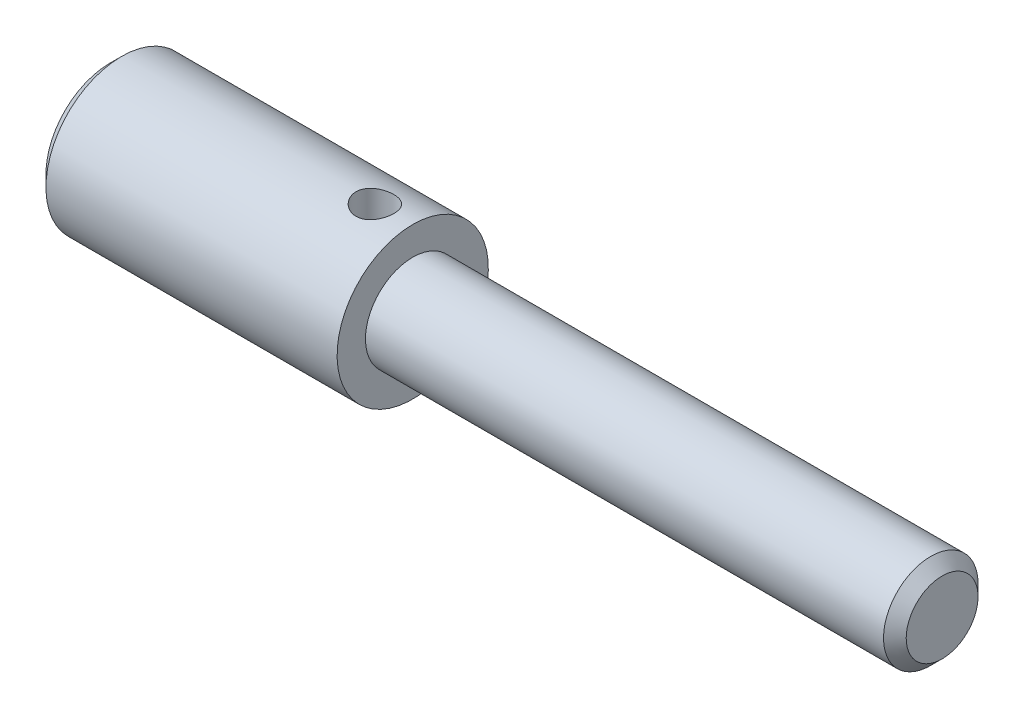
ISO-10303-21;
HEADER;
FILE_DESCRIPTION(('STEP AP214'),'2;1');
FILE_NAME('part.step','',(''),(''),'','','');
FILE_SCHEMA(('AUTOMOTIVE_DESIGN { 1 0 10303 214 1 1 1 1 }'));
ENDSEC;
DATA;
#1=APPLICATION_CONTEXT('core data for automotive mechanical design processes');
#2=APPLICATION_PROTOCOL_DEFINITION('international standard','automotive_design',2000,#1);
#3=PRODUCT_CONTEXT('',#1,'mechanical');
#4=PRODUCT('Part','Part','',(#3));
#5=PRODUCT_RELATED_PRODUCT_CATEGORY('part','',(#4));
#6=PRODUCT_DEFINITION_FORMATION('','',#4);
#7=PRODUCT_DEFINITION_CONTEXT('part definition',#1,'design');
#8=PRODUCT_DEFINITION('design','',#6,#7);
#9=PRODUCT_DEFINITION_SHAPE('','',#8);
#10=(LENGTH_UNIT() NAMED_UNIT(*) SI_UNIT(.MILLI.,.METRE.));
#11=(NAMED_UNIT(*) PLANE_ANGLE_UNIT() SI_UNIT($,.RADIAN.));
#12=(NAMED_UNIT(*) SI_UNIT($,.STERADIAN.) SOLID_ANGLE_UNIT());
#13=UNCERTAINTY_MEASURE_WITH_UNIT(LENGTH_MEASURE(1.E-05),#10,'distance_accuracy_value','');
#14=(GEOMETRIC_REPRESENTATION_CONTEXT(3) GLOBAL_UNCERTAINTY_ASSIGNED_CONTEXT((#13)) GLOBAL_UNIT_ASSIGNED_CONTEXT((#10,
#11,#12)) REPRESENTATION_CONTEXT('',''));
#15=CARTESIAN_POINT('',(0.,0.,0.));
#16=DIRECTION('',(0.,0.,1.));
#17=DIRECTION('',(1.,0.,0.));
#18=AXIS2_PLACEMENT_3D('',#15,#16,#17);
#19=CARTESIAN_POINT('',(0.,-4.,0.));
#20=DIRECTION('',(-1.,0.,0.));
#21=DIRECTION('',(0.,-1.,0.));
#22=AXIS2_PLACEMENT_3D('',#19,#20,#21);
#23=PLANE('',#22);
#24=CARTESIAN_POINT('',(0.,-4.,0.));
#25=DIRECTION('',(-1.,0.,0.));
#26=DIRECTION('',(0.,-1.,0.));
#27=AXIS2_PLACEMENT_3D('',#24,#25,#26);
#28=CIRCLE('',#27,3.39999999999999);
#29=CARTESIAN_POINT('',(0.,-4.,-3.39999999999999));
#30=VERTEX_POINT('',#29);
#31=EDGE_CURVE('E12',#30,#30,#28,.T.);
#32=ORIENTED_EDGE('',*,*,#31,.T.);
#33=EDGE_LOOP('',(#32));
#34=FACE_BOUND('',#33,.T.);
#35=ADVANCED_FACE('F46',(#34),#23,.T.);
#36=CARTESIAN_POINT('',(44.,-3.99999999999999,0.));
#37=DIRECTION('',(1.,0.,0.));
#38=DIRECTION('',(0.,1.,0.));
#39=AXIS2_PLACEMENT_3D('',#36,#37,#38);
#40=CYLINDRICAL_SURFACE('',#39,4.);
#41=CARTESIAN_POINT('',(14.,-0.127016653792582,1.));
#42=CARTESIAN_POINT('',(13.9447796996432,-0.12701559942815,0.999998431438699));
#43=CARTESIAN_POINT('',(13.8895420405686,-0.125822775007214,0.995410498208069));
#44=CARTESIAN_POINT('',(13.7806529687674,-0.121192551077508,0.977209250194446));
#45=CARTESIAN_POINT('',(13.72700249822,-0.117753845258195,0.963590682698077));
#46=CARTESIAN_POINT('',(13.6228785847122,-0.10904510186988,0.927796479849635));
#47=CARTESIAN_POINT('',(13.5724011378422,-0.103777429306402,0.905631891140943));
#48=CARTESIAN_POINT('',(13.4758756589875,-0.0920072318167267,0.853408456505407));
#49=CARTESIAN_POINT('',(13.4298278151689,-0.0855046544675919,0.823349275424505));
#50=CARTESIAN_POINT('',(13.3424553418942,-0.0718371345963169,0.755483370924518));
#51=CARTESIAN_POINT('',(13.3012425598597,-0.064661609512907,0.717534755081558));
#52=CARTESIAN_POINT('',(13.2256954422561,-0.0505484979337787,0.635272825640328));
#53=CARTESIAN_POINT('',(13.1913617497514,-0.0436109337330855,0.59095891767214));
#54=CARTESIAN_POINT('',(13.1300898129474,-0.0306383379190493,0.496458080431565));
#55=CARTESIAN_POINT('',(13.1032614447354,-0.0246172503979988,0.446197830478044));
#56=CARTESIAN_POINT('',(13.0584761423388,-0.0142767522956951,0.341705273717111));
#57=CARTESIAN_POINT('',(13.0405178992338,-0.00995709066252356,0.287473554316779));
#58=CARTESIAN_POINT('',(13.0143408661686,-0.00358096460737466,0.177743503501665));
#59=CARTESIAN_POINT('',(13.0059321422694,-0.00148042462276879,0.122293087819591));
#60=CARTESIAN_POINT('',(12.9984966482898,0.000374376429217088,0.0107315277051095));
#61=CARTESIAN_POINT('',(12.9994684911162,0.000128984386823097,-0.0453795178152259));
#62=CARTESIAN_POINT('',(13.0106299401001,-0.00264762018586736,-0.155352247172386));
#63=CARTESIAN_POINT('',(13.0206145300215,-0.00512799063650538,-0.209236215601066));
#64=CARTESIAN_POINT('',(13.0491885080194,-0.0120366539005819,-0.314538247413685));
#65=CARTESIAN_POINT('',(13.067778354151,-0.0164650504062358,-0.365956179370437));
#66=CARTESIAN_POINT('',(13.1132010282748,-0.0268499611964177,-0.465406703501805));
#67=CARTESIAN_POINT('',(13.1401068178647,-0.032819921219785,-0.513404509766503));
#68=CARTESIAN_POINT('',(13.2013422716465,-0.0456403847614024,-0.604275622340488));
#69=CARTESIAN_POINT('',(13.2356732274242,-0.0524910413900392,-0.647148035085504));
#70=CARTESIAN_POINT('',(13.3118834967929,-0.0665451449219182,-0.727774035084955));
#71=CARTESIAN_POINT('',(13.3539419569391,-0.073753121896329,-0.765357679075198));
#72=CARTESIAN_POINT('',(13.4438399894161,-0.0875398259331739,-0.832976375963018));
#73=CARTESIAN_POINT('',(13.4916798317964,-0.0941185235761168,-0.863011076046016));
#74=CARTESIAN_POINT('',(13.5921160136596,-0.105918012673405,-0.914788129022597));
#75=CARTESIAN_POINT('',(13.6447342921253,-0.111132065097117,-0.93648956697049));
#76=CARTESIAN_POINT('',(13.7530341872306,-0.119525439440172,-0.970685620636339));
#77=CARTESIAN_POINT('',(13.8087151455933,-0.122705196759125,-0.983182206552909));
#78=CARTESIAN_POINT('',(13.9199838006092,-0.126578575843436,-0.99833185546607));
#79=CARTESIAN_POINT('',(13.9755351173318,-0.127335643625406,-1.00123618956785));
#80=CARTESIAN_POINT('',(14.0863287746313,-0.126450626075842,-0.997806796206218));
#81=CARTESIAN_POINT('',(14.1415711431805,-0.124808761594935,-0.99147391913952));
#82=CARTESIAN_POINT('',(14.2492457059819,-0.119371672181758,-0.969970185575065));
#83=CARTESIAN_POINT('',(14.3017090906283,-0.1156121190625,-0.954945627312699));
#84=CARTESIAN_POINT('',(14.4033725831407,-0.10639712691615,-0.916647232668249));
#85=CARTESIAN_POINT('',(14.4525723036221,-0.100941487005545,-0.893372419085019));
#86=CARTESIAN_POINT('',(14.5473765111469,-0.0888154516269486,-0.838708267174624));
#87=CARTESIAN_POINT('',(14.5928915360172,-0.0821233255734327,-0.807168701534252));
#88=CARTESIAN_POINT('',(14.6780753451205,-0.0683316677131361,-0.737060292934456));
#89=CARTESIAN_POINT('',(14.71774316666,-0.061232069086118,-0.698490294805439));
#90=CARTESIAN_POINT('',(14.7911244170284,-0.0472103878735741,-0.614262720984725));
#91=CARTESIAN_POINT('',(14.8246640250195,-0.0402971917526563,-0.568451952531592));
#92=CARTESIAN_POINT('',(14.8835743467805,-0.0276111335450632,-0.471702682694676));
#93=CARTESIAN_POINT('',(14.9089454866433,-0.0218382119841587,-0.420764448957591));
#94=CARTESIAN_POINT('',(14.9505784138112,-0.0121195370467432,-0.315558201731091));
#95=CARTESIAN_POINT('',(14.9669057137516,-0.00816067991036,-0.261317381027882));
#96=CARTESIAN_POINT('',(14.9901841338434,-0.00245882641684631,-0.150749760318809));
#97=CARTESIAN_POINT('',(14.9971370634956,-0.00071540242636465,-0.0944233650412453));
#98=CARTESIAN_POINT('',(15.0013675895755,0.000341694088113032,0.0170835264433243));
#99=CARTESIAN_POINT('',(14.9989017090954,-0.000280211199915117,0.072253826966031));
#100=CARTESIAN_POINT('',(14.9849521727057,-0.00374103542576492,0.181367496414738));
#101=CARTESIAN_POINT('',(14.9734687849869,-0.00657988842905432,0.235310901780885));
#102=CARTESIAN_POINT('',(14.9419477802291,-0.0141456714603657,0.340171035644814));
#103=CARTESIAN_POINT('',(14.9219565466854,-0.0188623549733133,0.391102494581017));
#104=CARTESIAN_POINT('',(14.8740294209807,-0.0296871108661817,0.488917053041466));
#105=CARTESIAN_POINT('',(14.8460925273304,-0.0357953586227285,0.535799641265049));
#106=CARTESIAN_POINT('',(14.7822847660029,-0.0489275031865756,0.625401928423899));
#107=CARTESIAN_POINT('',(14.7462398570926,-0.0559698305435337,0.667994988300586));
#108=CARTESIAN_POINT('',(14.6675771480262,-0.0700935094679331,0.746615020271251));
#109=CARTESIAN_POINT('',(14.6249576839021,-0.0771748704757609,0.782640325068177));
#110=CARTESIAN_POINT('',(14.5333985857987,-0.0907252413931732,0.847762026479239));
#111=CARTESIAN_POINT('',(14.4843558765875,-0.0971803626960906,0.876716619446592));
#112=CARTESIAN_POINT('',(14.3819445100772,-0.108560444498902,0.925926896615621));
#113=CARTESIAN_POINT('',(14.3285790338927,-0.113486517551857,0.946188909759555));
#114=CARTESIAN_POINT('',(14.2294229881737,-0.120480912586851,0.97442252856557));
#115=CARTESIAN_POINT('',(14.1841068356176,-0.122913369942386,0.983993170595828));
#116=CARTESIAN_POINT('',(14.0925311309985,-0.126181614196419,0.996782292572818));
#117=CARTESIAN_POINT('',(14.0462716597494,-0.127017537293613,1.00000131437052));
#118=CARTESIAN_POINT('',(14.,-0.127016653792582,1.));
#119=B_SPLINE_CURVE_WITH_KNOTS('',3,(#41,#42,#43,#44,#45,#46,#47,#48,#49,#50,#51,#52,#53,#54,
#55,#56,#57,#58,#59,#60,#61,#62,#63,#64,#65,#66,#67,#68,#69,#70,#71,#72,#73,#74,#75,#76,#77,#78,
#79,#80,#81,#82,#83,#84,#85,#86,#87,#88,#89,#90,#91,#92,#93,#94,#95,#96,#97,#98,#99,#100,#101,
#102,#103,#104,#105,#106,#107,#108,#109,#110,#111,#112,#113,#114,#115,#116,#117,#118),
.UNSPECIFIED.,.T.,.F.,(4,2,2,2,2,2,2,2,2,2,2,2,2,2,2,2,2,2,2,2,2,2,2,2,2,2,2,2,2,2,2,2,2,2,2,2,
2,2,4),(0.,0.165490976675229,0.33107829653421,0.496452290829153,0.661833306984657,
0.830495816734647,0.99917408588221,1.17020598555442,1.34121263935111,1.50875500394413,
1.67627259462682,1.84007305071853,2.00388222686189,2.16917149698052,2.3344895418384,
2.50428186625039,2.67408212476195,2.84470572799635,3.01529280048093,3.18137429900961,
3.34744050869795,3.51078961999957,3.67415808564841,3.84073138339937,4.00733207550292,
4.17810132382402,4.34886166284095,4.51836829119046,4.68784219559889,4.85273378447257,
5.01762046947066,5.18161950620158,5.34563922291503,5.51358838629103,5.68158012622478,
5.85270590910145,6.02370688542922,6.16239130867206,6.30106390036083),.UNSPECIFIED.);
#120=CARTESIAN_POINT('',(14.,-0.127016653792582,1.));
#121=VERTEX_POINT('',#120);
#122=EDGE_CURVE('E81',#121,#121,#119,.T.);
#123=ORIENTED_EDGE('',*,*,#122,.T.);
#124=EDGE_LOOP('',(#123));
#125=FACE_BOUND('',#124,.T.);
#126=CARTESIAN_POINT('',(14.,-7.87298334620741,1.));
#127=CARTESIAN_POINT('',(14.0552203003568,-7.87298440057185,0.999998431438699));
#128=CARTESIAN_POINT('',(14.1104579594314,-7.87417722499278,0.995410498208069));
#129=CARTESIAN_POINT('',(14.2193470312326,-7.87880744892249,0.977209250194446));
#130=CARTESIAN_POINT('',(14.27299750178,-7.8822461547418,0.963590682698077));
#131=CARTESIAN_POINT('',(14.3771214152878,-7.89095489813012,0.927796479849635));
#132=CARTESIAN_POINT('',(14.4275988621578,-7.89622257069359,0.905631891140945));
#133=CARTESIAN_POINT('',(14.5241243410125,-7.90799276818327,0.853408456505408));
#134=CARTESIAN_POINT('',(14.5701721848311,-7.9144953455324,0.823349275424506));
#135=CARTESIAN_POINT('',(14.6575446581058,-7.92816286540368,0.755483370924518));
#136=CARTESIAN_POINT('',(14.6987574401403,-7.93533839048709,0.717534755081558));
#137=CARTESIAN_POINT('',(14.7743045577439,-7.94945150206622,0.635272825640329));
#138=CARTESIAN_POINT('',(14.8086382502486,-7.95638906626691,0.590958917672141));
#139=CARTESIAN_POINT('',(14.8699101870526,-7.96936166208095,0.496458080431566));
#140=CARTESIAN_POINT('',(14.8967385552646,-7.975382749602,0.446197830478045));
#141=CARTESIAN_POINT('',(14.9415238576612,-7.9857232477043,0.341705273717111));
#142=CARTESIAN_POINT('',(14.9594821007662,-7.99004290933747,0.287473554316779));
#143=CARTESIAN_POINT('',(14.9856591338314,-7.99641903539262,0.177743503501665));
#144=CARTESIAN_POINT('',(14.9940678577306,-7.99851957537723,0.122293087819592));
#145=CARTESIAN_POINT('',(15.0015033517102,-8.00037437642921,0.0107315277051097));
#146=CARTESIAN_POINT('',(15.0005315088838,-8.00012898438682,-0.0453795178152257));
#147=CARTESIAN_POINT('',(14.9893700598999,-7.99735237981413,-0.155352247172386));
#148=CARTESIAN_POINT('',(14.9793854699785,-7.99487200936349,-0.209236215601066));
#149=CARTESIAN_POINT('',(14.9508114919806,-7.98796334609942,-0.314538247413685));
#150=CARTESIAN_POINT('',(14.932221645849,-7.98353494959376,-0.365956179370437));
#151=CARTESIAN_POINT('',(14.8867989717252,-7.97315003880358,-0.465406703501805));
#152=CARTESIAN_POINT('',(14.8598931821353,-7.96718007878021,-0.513404509766503));
#153=CARTESIAN_POINT('',(14.7986577283535,-7.95435961523859,-0.604275622340487));
#154=CARTESIAN_POINT('',(14.7643267725758,-7.94750895860996,-0.647148035085503));
#155=CARTESIAN_POINT('',(14.6881165032071,-7.93345485507808,-0.727774035084954));
#156=CARTESIAN_POINT('',(14.6460580430609,-7.92624687810367,-0.765357679075198));
#157=CARTESIAN_POINT('',(14.5561600105839,-7.91246017406682,-0.832976375963017));
#158=CARTESIAN_POINT('',(14.5083201682036,-7.90588147642388,-0.863011076046016));
#159=CARTESIAN_POINT('',(14.4078839863404,-7.89408198732659,-0.914788129022596));
#160=CARTESIAN_POINT('',(14.3552657078747,-7.88886793490288,-0.936489566970489));
#161=CARTESIAN_POINT('',(14.2469658127694,-7.88047456055982,-0.970685620636339));
#162=CARTESIAN_POINT('',(14.1912848544068,-7.87729480324087,-0.983182206552909));
#163=CARTESIAN_POINT('',(14.0800161993908,-7.87342142415656,-0.99833185546607));
#164=CARTESIAN_POINT('',(14.0244648826682,-7.87266435637459,-1.00123618956785));
#165=CARTESIAN_POINT('',(13.9136712253687,-7.87354937392415,-0.997806796206218));
#166=CARTESIAN_POINT('',(13.8584288568195,-7.87519123840506,-0.99147391913952));
#167=CARTESIAN_POINT('',(13.7507542940181,-7.88062832781824,-0.969970185575065));
#168=CARTESIAN_POINT('',(13.6982909093717,-7.8843878809375,-0.954945627312699));
#169=CARTESIAN_POINT('',(13.5966274168593,-7.89360287308385,-0.916647232668249));
#170=CARTESIAN_POINT('',(13.5474276963779,-7.89905851299445,-0.893372419085019));
#171=CARTESIAN_POINT('',(13.4526234888531,-7.91118454837305,-0.838708267174624));
#172=CARTESIAN_POINT('',(13.4071084639828,-7.91787667442656,-0.807168701534253));
#173=CARTESIAN_POINT('',(13.3219246548795,-7.93166833228686,-0.737060292934457));
#174=CARTESIAN_POINT('',(13.28225683334,-7.93876793091388,-0.698490294805441));
#175=CARTESIAN_POINT('',(13.2088755829716,-7.95278961212642,-0.614262720984727));
#176=CARTESIAN_POINT('',(13.1753359749805,-7.95970280824734,-0.568451952531594));
#177=CARTESIAN_POINT('',(13.1164256532195,-7.97238886645493,-0.471702682694677));
#178=CARTESIAN_POINT('',(13.0910545133567,-7.97816178801584,-0.420764448957593));
#179=CARTESIAN_POINT('',(13.0494215861888,-7.98788046295325,-0.315558201731092));
#180=CARTESIAN_POINT('',(13.0330942862484,-7.99183932008964,-0.261317381027883));
#181=CARTESIAN_POINT('',(13.0098158661566,-7.99754117358315,-0.15074976031881));
#182=CARTESIAN_POINT('',(13.0028629365044,-7.99928459757363,-0.0944233650412455));
#183=CARTESIAN_POINT('',(12.9986324104245,-8.00034169408811,0.0170835264433242));
#184=CARTESIAN_POINT('',(13.0010982909046,-7.99971978880008,0.0722538269660308));
#185=CARTESIAN_POINT('',(13.0150478272943,-7.99625896457423,0.181367496414737));
#186=CARTESIAN_POINT('',(13.0265312150131,-7.99342011157094,0.235310901780884));
#187=CARTESIAN_POINT('',(13.0580522197709,-7.98585432853963,0.340171035644814));
#188=CARTESIAN_POINT('',(13.0780434533146,-7.98113764502668,0.391102494581017));
#189=CARTESIAN_POINT('',(13.1259705790193,-7.97031288913381,0.488917053041466));
#190=CARTESIAN_POINT('',(13.1539074726696,-7.96420464137727,0.535799641265049));
#191=CARTESIAN_POINT('',(13.2177152339971,-7.95107249681342,0.625401928423899));
#192=CARTESIAN_POINT('',(13.2537601429074,-7.94403016945646,0.667994988300586));
#193=CARTESIAN_POINT('',(13.3324228519738,-7.92990649053206,0.746615020271251));
#194=CARTESIAN_POINT('',(13.3750423160979,-7.92282512952423,0.782640325068177));
#195=CARTESIAN_POINT('',(13.4666014142013,-7.90927475860682,0.847762026479239));
#196=CARTESIAN_POINT('',(13.5156441234125,-7.90281963730391,0.876716619446592));
#197=CARTESIAN_POINT('',(13.6180554899228,-7.89143955550109,0.925926896615621));
#198=CARTESIAN_POINT('',(13.6714209661073,-7.88651348244814,0.946188909759555));
#199=CARTESIAN_POINT('',(13.7705770118263,-7.87951908741315,0.97442252856557));
#200=CARTESIAN_POINT('',(13.8158931643824,-7.87708663005761,0.983993170595828));
#201=CARTESIAN_POINT('',(13.9074688690015,-7.87381838580358,0.996782292572818));
#202=CARTESIAN_POINT('',(13.9537283402506,-7.87298246270638,1.00000131437052));
#203=CARTESIAN_POINT('',(14.,-7.87298334620741,1.));
#204=B_SPLINE_CURVE_WITH_KNOTS('',3,(#126,#127,#128,#129,#130,#131,#132,#133,#134,#135,#136,
#137,#138,#139,#140,#141,#142,#143,#144,#145,#146,#147,#148,#149,#150,#151,#152,#153,#154,#155,
#156,#157,#158,#159,#160,#161,#162,#163,#164,#165,#166,#167,#168,#169,#170,#171,#172,#173,#174,
#175,#176,#177,#178,#179,#180,#181,#182,#183,#184,#185,#186,#187,#188,#189,#190,#191,#192,#193,
#194,#195,#196,#197,#198,#199,#200,#201,#202,#203),.UNSPECIFIED.,.T.,.F.,(4,2,2,2,2,2,2,2,2,2,2,
2,2,2,2,2,2,2,2,2,2,2,2,2,2,2,2,2,2,2,2,2,2,2,2,2,2,2,4),(0.,0.165490976675229,0.33107829653421,
0.496452290829147,0.661833306984657,0.830495816734647,0.999174085882209,1.17020598555442,
1.34121263935111,1.50875500394413,1.67627259462682,1.84007305071853,2.00388222686189,
2.16917149698052,2.33448954183839,2.50428186625039,2.67408212476195,2.84470572799635,
3.01529280048093,3.18137429900961,3.34744050869795,3.51078961999957,3.67415808564841,
3.84073138339937,4.00733207550292,4.17810132382402,4.34886166284095,4.51836829119046,
4.68784219559889,4.85273378447257,5.01762046947066,5.18161950620158,5.34563922291503,
5.51358838629102,5.68158012622478,5.85270590910145,6.02370688542922,6.16239130867206,
6.30106390036083),.UNSPECIFIED.);
#205=CARTESIAN_POINT('',(14.,-7.87298334620741,1.));
#206=VERTEX_POINT('',#205);
#207=EDGE_CURVE('E73',#206,#206,#204,.T.);
#208=ORIENTED_EDGE('',*,*,#207,.T.);
#209=EDGE_LOOP('',(#208));
#210=FACE_BOUND('',#209,.T.);
#211=CARTESIAN_POINT('',(0.60000000000001,-4.,0.));
#212=DIRECTION('',(-1.,0.,0.));
#213=DIRECTION('',(0.,0.,1.));
#214=AXIS2_PLACEMENT_3D('',#211,#212,#213);
#215=CIRCLE('',#214,4.);
#216=CARTESIAN_POINT('',(0.60000000000001,-4.,-4.));
#217=VERTEX_POINT('',#216);
#218=EDGE_CURVE('E54',#217,#217,#215,.F.);
#219=ORIENTED_EDGE('',*,*,#218,.T.);
#220=EDGE_LOOP('',(#219));
#221=FACE_BOUND('',#220,.T.);
#222=CARTESIAN_POINT('',(16.,-4.,0.));
#223=DIRECTION('',(1.,0.,0.));
#224=DIRECTION('',(0.,1.,0.));
#225=AXIS2_PLACEMENT_3D('',#222,#223,#224);
#226=CIRCLE('',#225,4.);
#227=CARTESIAN_POINT('',(16.,0.,0.));
#228=VERTEX_POINT('',#227);
#229=EDGE_CURVE('E67',#228,#228,#226,.T.);
#230=ORIENTED_EDGE('',*,*,#229,.F.);
#231=EDGE_LOOP('',(#230));
#232=FACE_BOUND('',#231,.T.);
#233=ADVANCED_FACE('F105',(#125,#210,#221,#232),#40,.T.);
#234=CARTESIAN_POINT('',(16.,0.,0.));
#235=DIRECTION('',(1.,0.,0.));
#236=DIRECTION('',(0.,1.,0.));
#237=AXIS2_PLACEMENT_3D('',#234,#235,#236);
#238=PLANE('',#237);
#239=ORIENTED_EDGE('',*,*,#229,.T.);
#240=EDGE_LOOP('',(#239));
#241=FACE_BOUND('',#240,.T.);
#242=CARTESIAN_POINT('',(16.,-4.,0.));
#243=DIRECTION('',(1.,0.,0.));
#244=DIRECTION('',(0.,1.,0.));
#245=AXIS2_PLACEMENT_3D('',#242,#243,#244);
#246=CIRCLE('',#245,2.5);
#247=CARTESIAN_POINT('',(16.,-1.49999999999999,0.));
#248=VERTEX_POINT('',#247);
#249=EDGE_CURVE('E70',#248,#248,#246,.T.);
#250=ORIENTED_EDGE('',*,*,#249,.F.);
#251=EDGE_LOOP('',(#250));
#252=FACE_BOUND('',#251,.T.);
#253=ADVANCED_FACE('F101',(#241,#252),#238,.T.);
#254=CARTESIAN_POINT('',(44.,-3.99999999999999,0.));
#255=DIRECTION('',(1.,0.,0.));
#256=DIRECTION('',(0.,1.,0.));
#257=AXIS2_PLACEMENT_3D('',#254,#255,#256);
#258=CYLINDRICAL_SURFACE('',#257,2.5);
#259=CARTESIAN_POINT('',(43.4,-3.99999999999999,0.));
#260=DIRECTION('',(1.,0.,0.));
#261=DIRECTION('',(0.,0.,-1.));
#262=AXIS2_PLACEMENT_3D('',#259,#260,#261);
#263=CIRCLE('',#262,2.5);
#264=CARTESIAN_POINT('',(43.4,-3.99999999999999,2.50000000000001));
#265=VERTEX_POINT('',#264);
#266=EDGE_CURVE('E58',#265,#265,#263,.F.);
#267=ORIENTED_EDGE('',*,*,#266,.T.);
#268=EDGE_LOOP('',(#267));
#269=FACE_BOUND('',#268,.T.);
#270=ORIENTED_EDGE('',*,*,#249,.T.);
#271=EDGE_LOOP('',(#270));
#272=FACE_BOUND('',#271,.T.);
#273=ADVANCED_FACE('F97',(#269,#272),#258,.T.);
#274=CARTESIAN_POINT('',(44.,-1.49999999999999,0.));
#275=DIRECTION('',(1.,0.,0.));
#276=DIRECTION('',(0.,1.,0.));
#277=AXIS2_PLACEMENT_3D('',#274,#275,#276);
#278=PLANE('',#277);
#279=CARTESIAN_POINT('',(44.,-3.99999999999999,0.));
#280=DIRECTION('',(1.,0.,0.));
#281=DIRECTION('',(0.,1.,0.));
#282=AXIS2_PLACEMENT_3D('',#279,#280,#281);
#283=CIRCLE('',#282,1.89999999999999);
#284=CARTESIAN_POINT('',(44.,-3.99999999999999,1.89999999999999));
#285=VERTEX_POINT('',#284);
#286=EDGE_CURVE('E62',#285,#285,#283,.T.);
#287=ORIENTED_EDGE('',*,*,#286,.T.);
#288=EDGE_LOOP('',(#287));
#289=FACE_BOUND('',#288,.T.);
#290=ADVANCED_FACE('F92',(#289),#278,.T.);
#291=CARTESIAN_POINT('',(44.,-3.99999999999999,0.));
#292=DIRECTION('',(-1.,0.,0.));
#293=DIRECTION('',(0.,0.,1.));
#294=AXIS2_PLACEMENT_3D('',#291,#292,#293);
#295=CONICAL_SURFACE('',#294,1.89999999999999,0.785398163397449);
#296=CARTESIAN_POINT('',(43.4,-3.99999999999999,2.50000000000001));
#297=CARTESIAN_POINT('',(43.40625,-3.99999999999999,2.49375000000001));
#298=CARTESIAN_POINT('',(43.4125,-3.99999999999999,2.48750000000001));
#299=CARTESIAN_POINT('',(43.425,-3.99999999999999,2.475));
#300=CARTESIAN_POINT('',(43.43125,-3.99999999999999,2.46875));
#301=CARTESIAN_POINT('',(43.44375,-3.99999999999999,2.45625));
#302=CARTESIAN_POINT('',(43.45,-3.99999999999999,2.45));
#303=CARTESIAN_POINT('',(43.4625,-3.99999999999999,2.4375));
#304=CARTESIAN_POINT('',(43.46875,-3.99999999999999,2.43125));
#305=CARTESIAN_POINT('',(43.48125,-3.99999999999999,2.41875));
#306=CARTESIAN_POINT('',(43.4875,-3.99999999999999,2.4125));
#307=CARTESIAN_POINT('',(43.5,-3.99999999999999,2.4));
#308=CARTESIAN_POINT('',(43.50625,-3.99999999999999,2.39375));
#309=CARTESIAN_POINT('',(43.51875,-3.99999999999999,2.38125));
#310=CARTESIAN_POINT('',(43.525,-3.99999999999999,2.375));
#311=CARTESIAN_POINT('',(43.5375,-3.99999999999999,2.3625));
#312=CARTESIAN_POINT('',(43.54375,-3.99999999999999,2.35625));
#313=CARTESIAN_POINT('',(43.55625,-3.99999999999999,2.34375));
#314=CARTESIAN_POINT('',(43.5625,-3.99999999999999,2.3375));
#315=CARTESIAN_POINT('',(43.575,-3.99999999999999,2.325));
#316=CARTESIAN_POINT('',(43.58125,-3.99999999999999,2.31875));
#317=CARTESIAN_POINT('',(43.59375,-3.99999999999999,2.30625));
#318=CARTESIAN_POINT('',(43.6,-3.99999999999999,2.3));
#319=CARTESIAN_POINT('',(43.6125,-3.99999999999999,2.2875));
#320=CARTESIAN_POINT('',(43.61875,-3.99999999999999,2.28125));
#321=CARTESIAN_POINT('',(43.63125,-3.99999999999999,2.26875));
#322=CARTESIAN_POINT('',(43.6375,-3.99999999999999,2.2625));
#323=CARTESIAN_POINT('',(43.65,-3.99999999999999,2.25));
#324=CARTESIAN_POINT('',(43.65625,-3.99999999999999,2.24375));
#325=CARTESIAN_POINT('',(43.66875,-3.99999999999999,2.23125));
#326=CARTESIAN_POINT('',(43.675,-3.99999999999999,2.225));
#327=CARTESIAN_POINT('',(43.6875,-3.99999999999999,2.2125));
#328=CARTESIAN_POINT('',(43.69375,-3.99999999999999,2.20625));
#329=CARTESIAN_POINT('',(43.70625,-3.99999999999999,2.19375));
#330=CARTESIAN_POINT('',(43.7125,-3.99999999999999,2.1875));
#331=CARTESIAN_POINT('',(43.725,-3.99999999999999,2.175));
#332=CARTESIAN_POINT('',(43.73125,-3.99999999999999,2.16875));
#333=CARTESIAN_POINT('',(43.74375,-3.99999999999999,2.15625));
#334=CARTESIAN_POINT('',(43.75,-3.99999999999999,2.15));
#335=CARTESIAN_POINT('',(43.7625,-3.99999999999999,2.1375));
#336=CARTESIAN_POINT('',(43.76875,-3.99999999999999,2.13125));
#337=CARTESIAN_POINT('',(43.78125,-3.99999999999999,2.11875));
#338=CARTESIAN_POINT('',(43.7875,-3.99999999999999,2.1125));
#339=CARTESIAN_POINT('',(43.8,-3.99999999999999,2.1));
#340=CARTESIAN_POINT('',(43.80625,-3.99999999999999,2.09375));
#341=CARTESIAN_POINT('',(43.81875,-3.99999999999999,2.08125));
#342=CARTESIAN_POINT('',(43.825,-3.99999999999999,2.075));
#343=CARTESIAN_POINT('',(43.8375,-3.99999999999999,2.0625));
#344=CARTESIAN_POINT('',(43.84375,-3.99999999999999,2.05625));
#345=CARTESIAN_POINT('',(43.85625,-3.99999999999999,2.04375));
#346=CARTESIAN_POINT('',(43.8625,-3.99999999999999,2.0375));
#347=CARTESIAN_POINT('',(43.875,-3.99999999999999,2.025));
#348=CARTESIAN_POINT('',(43.88125,-3.99999999999999,2.01875));
#349=CARTESIAN_POINT('',(43.89375,-3.99999999999999,2.00625));
#350=CARTESIAN_POINT('',(43.9,-3.99999999999999,2.));
#351=CARTESIAN_POINT('',(43.9125,-3.99999999999999,1.9875));
#352=CARTESIAN_POINT('',(43.91875,-3.99999999999999,1.98125));
#353=CARTESIAN_POINT('',(43.93125,-3.99999999999999,1.96875));
#354=CARTESIAN_POINT('',(43.9375,-3.99999999999999,1.9625));
#355=CARTESIAN_POINT('',(43.95,-3.99999999999999,1.95));
#356=CARTESIAN_POINT('',(43.95625,-3.99999999999999,1.94375));
#357=CARTESIAN_POINT('',(43.96875,-3.99999999999999,1.93125));
#358=CARTESIAN_POINT('',(43.975,-3.99999999999999,1.925));
#359=CARTESIAN_POINT('',(43.9875,-3.99999999999999,1.91249999999999));
#360=CARTESIAN_POINT('',(43.99375,-3.99999999999999,1.90624999999999));
#361=CARTESIAN_POINT('',(44.,-3.99999999999999,1.89999999999999));
#362=B_SPLINE_CURVE_WITH_KNOTS('',3,(#296,#297,#298,#299,#300,#301,#302,#303,#304,#305,#306,
#307,#308,#309,#310,#311,#312,#313,#314,#315,#316,#317,#318,#319,#320,#321,#322,#323,#324,#325,
#326,#327,#328,#329,#330,#331,#332,#333,#334,#335,#336,#337,#338,#339,#340,#341,#342,#343,#344,
#345,#346,#347,#348,#349,#350,#351,#352,#353,#354,#355,#356,#357,#358,#359,#360,#361),
.UNSPECIFIED.,.F.,.F.,(4,2,2,2,2,2,2,2,2,2,2,2,2,2,2,2,2,2,2,2,2,2,2,2,2,2,2,2,2,2,2,2,4),(0.,
0.0265165042944941,0.0530330085889886,0.079549512883488,0.106066017177982,0.132582521472476,
0.159099025766976,0.18561553006147,0.212132034355964,0.238648538650464,0.265165042944958,
0.291681547239452,0.318198051533951,0.344714555828446,0.37123106012294,0.397747564417439,
0.424264068711933,0.450780573006428,0.477297077300927,0.503813581595421,0.530330085889916,
0.556846590184415,0.583363094478909,0.609879598773403,0.636396103067903,0.662912607362397,
0.689429111656891,0.71594561595139,0.742462120245885,0.768978624540379,0.795495128834878,
0.822011633129373,0.848528137423872),.UNSPECIFIED.);
#363=EDGE_CURVE('BSEAM96',#265,#285,#362,.T.);
#364=ORIENTED_EDGE('',*,*,#266,.F.);
#365=ORIENTED_EDGE('',*,*,#286,.F.);
#366=ORIENTED_EDGE('',*,*,#363,.T.);
#367=ORIENTED_EDGE('',*,*,#363,.F.);
#368=EDGE_LOOP('',(#364,#366,#365,#367));
#369=FACE_BOUND('',#368,.T.);
#370=ADVANCED_FACE('F96',(#369),#295,.T.);
#371=CARTESIAN_POINT('',(0.60000000000001,-4.,0.));
#372=DIRECTION('',(1.,0.,0.));
#373=DIRECTION('',(0.,0.,-1.));
#374=AXIS2_PLACEMENT_3D('',#371,#372,#373);
#375=CONICAL_SURFACE('',#374,4.,0.785398163397448);
#376=CARTESIAN_POINT('',(0.,-4.,-3.39999999999999));
#377=CARTESIAN_POINT('',(0.00625000000000046,-4.,-3.40624999999999));
#378=CARTESIAN_POINT('',(0.0125000000000006,-4.,-3.41249999999999));
#379=CARTESIAN_POINT('',(0.0250000000000007,-4.,-3.42499999999999));
#380=CARTESIAN_POINT('',(0.0312500000000008,-4.,-3.43124999999999));
#381=CARTESIAN_POINT('',(0.043750000000001,-4.,-3.44374999999999));
#382=CARTESIAN_POINT('',(0.0500000000000012,-4.,-3.44999999999999));
#383=CARTESIAN_POINT('',(0.0625000000000014,-4.,-3.46249999999999));
#384=CARTESIAN_POINT('',(0.0687500000000015,-4.,-3.46874999999999));
#385=CARTESIAN_POINT('',(0.0812500000000018,-4.,-3.48124999999999));
#386=CARTESIAN_POINT('',(0.0875000000000018,-4.,-3.48749999999999));
#387=CARTESIAN_POINT('',(0.100000000000002,-4.,-3.49999999999999));
#388=CARTESIAN_POINT('',(0.106250000000002,-4.,-3.50624999999999));
#389=CARTESIAN_POINT('',(0.118750000000002,-4.,-3.51874999999999));
#390=CARTESIAN_POINT('',(0.125000000000002,-4.,-3.52499999999999));
#391=CARTESIAN_POINT('',(0.137500000000003,-4.,-3.53749999999999));
#392=CARTESIAN_POINT('',(0.143750000000003,-4.,-3.54374999999999));
#393=CARTESIAN_POINT('',(0.156250000000003,-4.,-3.55624999999999));
#394=CARTESIAN_POINT('',(0.162500000000003,-4.,-3.56249999999999));
#395=CARTESIAN_POINT('',(0.175000000000003,-4.,-3.57499999999999));
#396=CARTESIAN_POINT('',(0.181250000000003,-4.,-3.58124999999999));
#397=CARTESIAN_POINT('',(0.193750000000004,-4.,-3.59374999999999));
#398=CARTESIAN_POINT('',(0.200000000000004,-4.,-3.59999999999999));
#399=CARTESIAN_POINT('',(0.212500000000004,-4.,-3.61249999999999));
#400=CARTESIAN_POINT('',(0.218750000000004,-4.,-3.61874999999999));
#401=CARTESIAN_POINT('',(0.231250000000004,-4.,-3.63124999999999));
#402=CARTESIAN_POINT('',(0.237500000000004,-4.,-3.63749999999999));
#403=CARTESIAN_POINT('',(0.250000000000004,-4.,-3.64999999999999));
#404=CARTESIAN_POINT('',(0.256250000000005,-4.,-3.65624999999999));
#405=CARTESIAN_POINT('',(0.268750000000005,-4.,-3.66874999999999));
#406=CARTESIAN_POINT('',(0.275000000000005,-4.,-3.67499999999999));
#407=CARTESIAN_POINT('',(0.287500000000005,-4.,-3.68749999999999));
#408=CARTESIAN_POINT('',(0.293750000000005,-4.,-3.69374999999999));
#409=CARTESIAN_POINT('',(0.306250000000005,-4.,-3.70624999999999));
#410=CARTESIAN_POINT('',(0.312500000000006,-4.,-3.71249999999999));
#411=CARTESIAN_POINT('',(0.325000000000006,-4.,-3.72499999999999));
#412=CARTESIAN_POINT('',(0.331250000000006,-4.,-3.73124999999999));
#413=CARTESIAN_POINT('',(0.343750000000006,-4.,-3.74375));
#414=CARTESIAN_POINT('',(0.350000000000006,-4.,-3.75));
#415=CARTESIAN_POINT('',(0.362500000000006,-4.,-3.7625));
#416=CARTESIAN_POINT('',(0.368750000000007,-4.,-3.76875));
#417=CARTESIAN_POINT('',(0.381250000000007,-4.,-3.78125));
#418=CARTESIAN_POINT('',(0.387500000000007,-4.,-3.7875));
#419=CARTESIAN_POINT('',(0.400000000000007,-4.,-3.8));
#420=CARTESIAN_POINT('',(0.406250000000007,-4.,-3.80625));
#421=CARTESIAN_POINT('',(0.418750000000007,-4.,-3.81875));
#422=CARTESIAN_POINT('',(0.425000000000007,-4.,-3.825));
#423=CARTESIAN_POINT('',(0.437500000000008,-4.,-3.8375));
#424=CARTESIAN_POINT('',(0.443750000000008,-4.,-3.84375));
#425=CARTESIAN_POINT('',(0.456250000000008,-4.,-3.85625));
#426=CARTESIAN_POINT('',(0.462500000000008,-4.,-3.8625));
#427=CARTESIAN_POINT('',(0.475000000000008,-4.,-3.875));
#428=CARTESIAN_POINT('',(0.481250000000008,-4.,-3.88125));
#429=CARTESIAN_POINT('',(0.493750000000009,-4.,-3.89375));
#430=CARTESIAN_POINT('',(0.500000000000009,-4.,-3.9));
#431=CARTESIAN_POINT('',(0.512500000000009,-4.,-3.9125));
#432=CARTESIAN_POINT('',(0.518750000000009,-4.,-3.91875));
#433=CARTESIAN_POINT('',(0.531250000000009,-4.,-3.93125));
#434=CARTESIAN_POINT('',(0.537500000000009,-4.,-3.9375));
#435=CARTESIAN_POINT('',(0.550000000000009,-4.,-3.95));
#436=CARTESIAN_POINT('',(0.55625000000001,-4.,-3.95625));
#437=CARTESIAN_POINT('',(0.56875000000001,-4.,-3.96875));
#438=CARTESIAN_POINT('',(0.57500000000001,-4.,-3.975));
#439=CARTESIAN_POINT('',(0.58750000000001,-4.,-3.9875));
#440=CARTESIAN_POINT('',(0.593750000000011,-4.,-3.99375));
#441=CARTESIAN_POINT('',(0.60000000000001,-4.,-4.));
#442=B_SPLINE_CURVE_WITH_KNOTS('',3,(#376,#377,#378,#379,#380,#381,#382,#383,#384,#385,#386,
#387,#388,#389,#390,#391,#392,#393,#394,#395,#396,#397,#398,#399,#400,#401,#402,#403,#404,#405,
#406,#407,#408,#409,#410,#411,#412,#413,#414,#415,#416,#417,#418,#419,#420,#421,#422,#423,#424,
#425,#426,#427,#428,#429,#430,#431,#432,#433,#434,#435,#436,#437,#438,#439,#440,#441),
.UNSPECIFIED.,.F.,.F.,(4,2,2,2,2,2,2,2,2,2,2,2,2,2,2,2,2,2,2,2,2,2,2,2,2,2,2,2,2,2,2,2,4),(0.,
0.0265165042944961,0.0530330085889923,0.0795495128834881,0.106066017177984,0.13258252147248,
0.159099025766976,0.185615530061472,0.212132034355968,0.238648538650464,0.26516504294496,
0.291681547239456,0.318198051533952,0.344714555828448,0.371231060122944,0.39774756441744,
0.424264068711936,0.450780573006432,0.477297077300928,0.503813581595424,0.53033008588992,
0.556846590184416,0.583363094478912,0.609879598773408,0.636396103067904,0.6629126073624,
0.689429111656895,0.715945615951392,0.742462120245887,0.768978624540383,0.795495128834879,
0.822011633129375,0.848528137423871),.UNSPECIFIED.);
#443=EDGE_CURVE('BSEAM49',#30,#217,#442,.T.);
#444=ORIENTED_EDGE('',*,*,#31,.F.);
#445=ORIENTED_EDGE('',*,*,#218,.F.);
#446=ORIENTED_EDGE('',*,*,#443,.T.);
#447=ORIENTED_EDGE('',*,*,#443,.F.);
#448=EDGE_LOOP('',(#444,#446,#445,#447));
#449=FACE_BOUND('',#448,.T.);
#450=ADVANCED_FACE('F49',(#449),#375,.T.);
#451=CARTESIAN_POINT('',(14.,-8.001,0.));
#452=DIRECTION('',(0.,1.,0.));
#453=DIRECTION('',(0.,0.,1.));
#454=AXIS2_PLACEMENT_3D('',#451,#452,#453);
#455=CYLINDRICAL_SURFACE('',#454,1.);
#456=ORIENTED_EDGE('',*,*,#207,.F.);
#457=EDGE_LOOP('',(#456));
#458=FACE_BOUND('',#457,.T.);
#459=ORIENTED_EDGE('',*,*,#122,.F.);
#460=EDGE_LOOP('',(#459));
#461=FACE_BOUND('',#460,.T.);
#462=ADVANCED_FACE('F85',(#458,#461),#455,.F.);
#463=CLOSED_SHELL('',(#35,#233,#253,#273,#290,#370,#450,#462));
#464=MANIFOLD_SOLID_BREP('B2',#463);
#465=ADVANCED_BREP_SHAPE_REPRESENTATION('',(#18,#464),#14);
#466=SHAPE_DEFINITION_REPRESENTATION(#9,#465);
ENDSEC;
END-ISO-10303-21;
